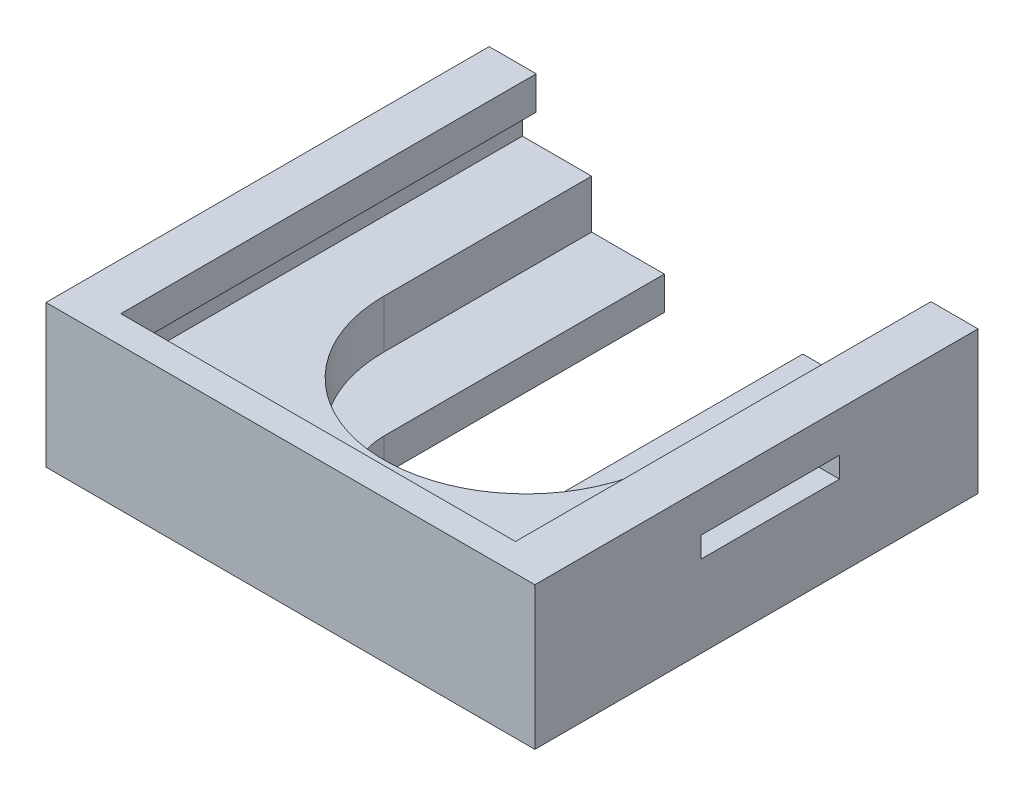
ISO-10303-21;
HEADER;
FILE_DESCRIPTION(('STEP AP214'),'2;1');
FILE_NAME('part.step','',(''),(''),'','','');
FILE_SCHEMA(('AUTOMOTIVE_DESIGN { 1 0 10303 214 1 1 1 1 }'));
ENDSEC;
DATA;
#1=APPLICATION_CONTEXT('core data for automotive mechanical design processes');
#2=APPLICATION_PROTOCOL_DEFINITION('international standard','automotive_design',2000,#1);
#3=PRODUCT_CONTEXT('',#1,'mechanical');
#4=PRODUCT('Part','Part','',(#3));
#5=PRODUCT_RELATED_PRODUCT_CATEGORY('part','',(#4));
#6=PRODUCT_DEFINITION_FORMATION('','',#4);
#7=PRODUCT_DEFINITION_CONTEXT('part definition',#1,'design');
#8=PRODUCT_DEFINITION('design','',#6,#7);
#9=PRODUCT_DEFINITION_SHAPE('','',#8);
#10=(LENGTH_UNIT() NAMED_UNIT(*) SI_UNIT(.MILLI.,.METRE.));
#11=(NAMED_UNIT(*) PLANE_ANGLE_UNIT() SI_UNIT($,.RADIAN.));
#12=(NAMED_UNIT(*) SI_UNIT($,.STERADIAN.) SOLID_ANGLE_UNIT());
#13=UNCERTAINTY_MEASURE_WITH_UNIT(LENGTH_MEASURE(1.E-05),#10,'distance_accuracy_value','');
#14=(GEOMETRIC_REPRESENTATION_CONTEXT(3) GLOBAL_UNCERTAINTY_ASSIGNED_CONTEXT((#13)) GLOBAL_UNIT_ASSIGNED_CONTEXT((#10,
#11,#12)) REPRESENTATION_CONTEXT('',''));
#15=CARTESIAN_POINT('',(0.,0.,0.));
#16=DIRECTION('',(0.,0.,1.));
#17=DIRECTION('',(1.,0.,0.));
#18=AXIS2_PLACEMENT_3D('',#15,#16,#17);
#19=CARTESIAN_POINT('',(0.,0.,0.));
#20=DIRECTION('',(0.,0.,1.));
#21=DIRECTION('',(1.,0.,0.));
#22=AXIS2_PLACEMENT_3D('',#19,#20,#21);
#23=PLANE('',#22);
#24=DIRECTION('',(-1.,0.,0.));
#25=VECTOR('',#24,1.);
#26=CARTESIAN_POINT('',(5.00000000000001,-3.5,0.));
#27=LINE('',#26,#25);
#28=CARTESIAN_POINT('',(10.25,-3.5,0.));
#29=VERTEX_POINT('',#28);
#30=CARTESIAN_POINT('',(5.00000000000001,-3.5,0.));
#31=VERTEX_POINT('',#30);
#32=EDGE_CURVE('E280',#29,#31,#27,.T.);
#33=ORIENTED_EDGE('',*,*,#32,.F.);
#34=DIRECTION('',(0.,1.,0.));
#35=VECTOR('',#34,1.);
#36=CARTESIAN_POINT('',(10.25,-5.9,0.));
#37=LINE('',#36,#35);
#38=CARTESIAN_POINT('',(10.25,-5.9,0.));
#39=VERTEX_POINT('',#38);
#40=EDGE_CURVE('E272',#39,#29,#37,.T.);
#41=ORIENTED_EDGE('',*,*,#40,.F.);
#42=DIRECTION('',(1.,0.,0.));
#43=VECTOR('',#42,1.);
#44=CARTESIAN_POINT('',(0.,-5.9,0.));
#45=LINE('',#44,#43);
#46=CARTESIAN_POINT('',(-2.4,-5.9,0.));
#47=VERTEX_POINT('',#46);
#48=EDGE_CURVE('E332',#47,#39,#45,.T.);
#49=ORIENTED_EDGE('',*,*,#48,.F.);
#50=DIRECTION('',(0.,-1.,0.));
#51=VECTOR('',#50,1.);
#52=CARTESIAN_POINT('',(-2.4,0.,0.));
#53=LINE('',#52,#51);
#54=CARTESIAN_POINT('',(-2.4,4.4,0.));
#55=VERTEX_POINT('',#54);
#56=EDGE_CURVE('E206',#55,#47,#53,.T.);
#57=ORIENTED_EDGE('',*,*,#56,.F.);
#58=DIRECTION('',(-1.,0.,0.));
#59=VECTOR('',#58,1.);
#60=CARTESIAN_POINT('',(0.,4.4,0.));
#61=LINE('',#60,#59);
#62=CARTESIAN_POINT('',(1.,4.4,0.));
#63=VERTEX_POINT('',#62);
#64=EDGE_CURVE('E311',#63,#55,#61,.T.);
#65=ORIENTED_EDGE('',*,*,#64,.F.);
#66=DIRECTION('',(0.,1.,0.));
#67=VECTOR('',#66,1.);
#68=CARTESIAN_POINT('',(1.,0.,0.));
#69=LINE('',#68,#67);
#70=CARTESIAN_POINT('',(1.,2.,0.));
#71=VERTEX_POINT('',#70);
#72=EDGE_CURVE('E357',#71,#63,#69,.T.);
#73=ORIENTED_EDGE('',*,*,#72,.F.);
#74=DIRECTION('',(1.,0.,0.));
#75=VECTOR('',#74,1.);
#76=CARTESIAN_POINT('',(0.,2.,0.));
#77=LINE('',#76,#75);
#78=CARTESIAN_POINT('',(0.,2.,0.));
#79=VERTEX_POINT('',#78);
#80=EDGE_CURVE('E355',#79,#71,#77,.T.);
#81=ORIENTED_EDGE('',*,*,#80,.F.);
#82=DIRECTION('',(0.,1.,0.));
#83=VECTOR('',#82,1.);
#84=CARTESIAN_POINT('',(0.,0.,0.));
#85=LINE('',#84,#83);
#86=CARTESIAN_POINT('',(0.,0.,0.));
#87=VERTEX_POINT('',#86);
#88=EDGE_CURVE('E353',#87,#79,#85,.T.);
#89=ORIENTED_EDGE('',*,*,#88,.F.);
#90=DIRECTION('',(1.,0.,0.));
#91=VECTOR('',#90,1.);
#92=CARTESIAN_POINT('',(0.,0.,0.));
#93=LINE('',#92,#91);
#94=CARTESIAN_POINT('',(5.00000000000001,0.,0.));
#95=VERTEX_POINT('',#94);
#96=EDGE_CURVE('E350',#87,#95,#93,.T.);
#97=ORIENTED_EDGE('',*,*,#96,.T.);
#98=DIRECTION('',(0.,1.,0.));
#99=VECTOR('',#98,1.);
#100=CARTESIAN_POINT('',(5.00000000000001,-3.5,0.));
#101=LINE('',#100,#99);
#102=EDGE_CURVE('E303',#31,#95,#101,.T.);
#103=ORIENTED_EDGE('',*,*,#102,.F.);
#104=EDGE_LOOP('',(#33,#41,#49,#57,#65,#73,#81,#89,#97,#103));
#105=FACE_BOUND('',#104,.T.);
#106=ADVANCED_FACE('F35',(#105),#23,.F.);
#107=CARTESIAN_POINT('',(15.25,-3.5,15.));
#108=DIRECTION('',(0.,1.,0.));
#109=DIRECTION('',(0.,0.,1.));
#110=AXIS2_PLACEMENT_3D('',#107,#108,#109);
#111=PLANE('',#110);
#112=DIRECTION('',(0.,0.,1.));
#113=VECTOR('',#112,1.);
#114=CARTESIAN_POINT('',(10.25,-3.5,20.25));
#115=LINE('',#114,#113);
#116=CARTESIAN_POINT('',(10.25,-3.5,20.25));
#117=VERTEX_POINT('',#116);
#118=EDGE_CURVE('E257',#29,#117,#115,.T.);
#119=ORIENTED_EDGE('',*,*,#118,.F.);
#120=ORIENTED_EDGE('',*,*,#32,.T.);
#121=DIRECTION('',(0.,0.,1.));
#122=VECTOR('',#121,1.);
#123=CARTESIAN_POINT('',(5.00000000000001,-3.5,15.));
#124=LINE('',#123,#122);
#125=CARTESIAN_POINT('',(5.00000000000001,-3.5,15.));
#126=VERTEX_POINT('',#125);
#127=EDGE_CURVE('E285',#31,#126,#124,.T.);
#128=ORIENTED_EDGE('',*,*,#127,.T.);
#129=CARTESIAN_POINT('',(15.25,-3.5,15.));
#130=DIRECTION('',(0.,1.,0.));
#131=DIRECTION('',(0.,0.,1.));
#132=AXIS2_PLACEMENT_3D('',#129,#130,#131);
#133=CIRCLE('',#132,10.25);
#134=CARTESIAN_POINT('',(15.25,-3.5,25.25));
#135=VERTEX_POINT('',#134);
#136=EDGE_CURVE('E289',#126,#135,#133,.T.);
#137=ORIENTED_EDGE('',*,*,#136,.T.);
#138=CARTESIAN_POINT('',(15.25,-3.5,20.25));
#139=DIRECTION('',(0.,1.,0.));
#140=DIRECTION('',(0.,0.,1.));
#141=AXIS2_PLACEMENT_3D('',#138,#139,#140);
#142=CIRCLE('',#141,5.);
#143=EDGE_CURVE('E252',#117,#135,#142,.T.);
#144=ORIENTED_EDGE('',*,*,#143,.F.);
#145=EDGE_LOOP('',(#119,#120,#128,#137,#144));
#146=FACE_BOUND('',#145,.T.);
#147=ADVANCED_FACE('F460',(#146),#111,.T.);
#148=CARTESIAN_POINT('',(-2.4,0.,30.));
#149=DIRECTION('',(1.,0.,0.));
#150=DIRECTION('',(0.,1.,0.));
#151=AXIS2_PLACEMENT_3D('',#148,#149,#150);
#152=PLANE('',#151);
#153=ORIENTED_EDGE('',*,*,#56,.T.);
#154=DIRECTION('',(0.,0.,-1.));
#155=VECTOR('',#154,1.);
#156=CARTESIAN_POINT('',(-2.4,-5.9,30.));
#157=LINE('',#156,#155);
#158=CARTESIAN_POINT('',(-2.4,-5.9,32.));
#159=VERTEX_POINT('',#158);
#160=EDGE_CURVE('E43',#159,#47,#157,.T.);
#161=ORIENTED_EDGE('',*,*,#160,.F.);
#162=DIRECTION('',(0.,-1.,0.));
#163=VECTOR('',#162,1.);
#164=CARTESIAN_POINT('',(-2.4,-5.9,32.));
#165=LINE('',#164,#163);
#166=CARTESIAN_POINT('',(-2.4,4.4,32.));
#167=VERTEX_POINT('',#166);
#168=EDGE_CURVE('E204',#167,#159,#165,.T.);
#169=ORIENTED_EDGE('',*,*,#168,.F.);
#170=DIRECTION('',(0.,0.,-1.));
#171=VECTOR('',#170,1.);
#172=CARTESIAN_POINT('',(-2.4,4.4,30.));
#173=LINE('',#172,#171);
#174=EDGE_CURVE('E329',#167,#55,#173,.T.);
#175=ORIENTED_EDGE('',*,*,#174,.T.);
#176=EDGE_LOOP('',(#153,#161,#169,#175));
#177=FACE_BOUND('',#176,.T.);
#178=ADVANCED_FACE('F37',(#177),#152,.F.);
#179=CARTESIAN_POINT('',(0.,-5.9,30.));
#180=DIRECTION('',(0.,1.,0.));
#181=DIRECTION('',(-1.,0.,0.));
#182=AXIS2_PLACEMENT_3D('',#179,#180,#181);
#183=PLANE('',#182);
#184=ORIENTED_EDGE('',*,*,#48,.T.);
#185=DIRECTION('',(0.,0.,1.));
#186=VECTOR('',#185,1.);
#187=CARTESIAN_POINT('',(10.25,-5.9,20.25));
#188=LINE('',#187,#186);
#189=CARTESIAN_POINT('',(10.25,-5.9,20.25));
#190=VERTEX_POINT('',#189);
#191=EDGE_CURVE('E260',#39,#190,#188,.T.);
#192=ORIENTED_EDGE('',*,*,#191,.T.);
#193=CARTESIAN_POINT('',(15.25,-5.9,20.25));
#194=DIRECTION('',(0.,1.,0.));
#195=DIRECTION('',(0.,0.,1.));
#196=AXIS2_PLACEMENT_3D('',#193,#194,#195);
#197=CIRCLE('',#196,5.);
#198=CARTESIAN_POINT('',(20.25,-5.9,20.25));
#199=VERTEX_POINT('',#198);
#200=EDGE_CURVE('E253',#190,#199,#197,.T.);
#201=ORIENTED_EDGE('',*,*,#200,.T.);
#202=DIRECTION('',(0.,0.,-1.));
#203=VECTOR('',#202,1.);
#204=CARTESIAN_POINT('',(20.25,-5.9,0.));
#205=LINE('',#204,#203);
#206=CARTESIAN_POINT('',(20.25,-5.9,0.));
#207=VERTEX_POINT('',#206);
#208=EDGE_CURVE('E256',#199,#207,#205,.T.);
#209=ORIENTED_EDGE('',*,*,#208,.T.);
#210=CARTESIAN_POINT('',(32.9,-5.9,0.));
#211=VERTEX_POINT('',#210);
#212=EDGE_CURVE('E331',#207,#211,#45,.T.);
#213=ORIENTED_EDGE('',*,*,#212,.T.);
#214=DIRECTION('',(0.,0.,-1.));
#215=VECTOR('',#214,1.);
#216=CARTESIAN_POINT('',(32.9,-5.9,30.));
#217=LINE('',#216,#215);
#218=CARTESIAN_POINT('',(32.9,-5.9,32.));
#219=VERTEX_POINT('',#218);
#220=EDGE_CURVE('E209',#219,#211,#217,.T.);
#221=ORIENTED_EDGE('',*,*,#220,.F.);
#222=DIRECTION('',(1.,0.,0.));
#223=VECTOR('',#222,1.);
#224=CARTESIAN_POINT('',(-2.4,-5.9,32.));
#225=LINE('',#224,#223);
#226=EDGE_CURVE('E211',#159,#219,#225,.T.);
#227=ORIENTED_EDGE('',*,*,#226,.F.);
#228=ORIENTED_EDGE('',*,*,#160,.T.);
#229=EDGE_LOOP('',(#184,#192,#201,#209,#213,#221,#227,#228));
#230=FACE_BOUND('',#229,.T.);
#231=ADVANCED_FACE('F212',(#230),#183,.F.);
#232=CARTESIAN_POINT('',(32.9,0.,30.));
#233=DIRECTION('',(1.,0.,0.));
#234=DIRECTION('',(0.,0.,-1.));
#235=AXIS2_PLACEMENT_3D('',#232,#233,#234);
#236=PLANE('',#235);
#237=DIRECTION('',(0.,1.,0.));
#238=VECTOR('',#237,1.);
#239=CARTESIAN_POINT('',(32.9,0.,10.));
#240=LINE('',#239,#238);
#241=CARTESIAN_POINT('',(32.9,0.,10.));
#242=VERTEX_POINT('',#241);
#243=CARTESIAN_POINT('',(32.9,1.5,10.));
#244=VERTEX_POINT('',#243);
#245=EDGE_CURVE('E250',#242,#244,#240,.T.);
#246=ORIENTED_EDGE('',*,*,#245,.F.);
#247=DIRECTION('',(0.,0.,-1.));
#248=VECTOR('',#247,1.);
#249=CARTESIAN_POINT('',(32.9,0.,30.));
#250=LINE('',#249,#248);
#251=CARTESIAN_POINT('',(32.9,0.,20.));
#252=VERTEX_POINT('',#251);
#253=EDGE_CURVE('E240',#252,#242,#250,.T.);
#254=ORIENTED_EDGE('',*,*,#253,.F.);
#255=DIRECTION('',(0.,-1.,0.));
#256=VECTOR('',#255,1.);
#257=CARTESIAN_POINT('',(32.9,0.,20.));
#258=LINE('',#257,#256);
#259=CARTESIAN_POINT('',(32.9,1.5,20.));
#260=VERTEX_POINT('',#259);
#261=EDGE_CURVE('E246',#260,#252,#258,.T.);
#262=ORIENTED_EDGE('',*,*,#261,.F.);
#263=DIRECTION('',(0.,0.,1.));
#264=VECTOR('',#263,1.);
#265=CARTESIAN_POINT('',(32.9,1.5,30.));
#266=LINE('',#265,#264);
#267=EDGE_CURVE('E248',#244,#260,#266,.T.);
#268=ORIENTED_EDGE('',*,*,#267,.F.);
#269=EDGE_LOOP('',(#246,#254,#262,#268));
#270=FACE_BOUND('',#269,.T.);
#271=DIRECTION('',(0.,-1.,0.));
#272=VECTOR('',#271,1.);
#273=CARTESIAN_POINT('',(32.9,0.,0.));
#274=LINE('',#273,#272);
#275=CARTESIAN_POINT('',(32.9,4.4,0.));
#276=VERTEX_POINT('',#275);
#277=EDGE_CURVE('E334',#276,#211,#274,.T.);
#278=ORIENTED_EDGE('',*,*,#277,.F.);
#279=DIRECTION('',(0.,0.,-1.));
#280=VECTOR('',#279,1.);
#281=CARTESIAN_POINT('',(32.9,4.4,30.));
#282=LINE('',#281,#280);
#283=CARTESIAN_POINT('',(32.9,4.4,32.));
#284=VERTEX_POINT('',#283);
#285=EDGE_CURVE('E381',#284,#276,#282,.T.);
#286=ORIENTED_EDGE('',*,*,#285,.F.);
#287=DIRECTION('',(0.,1.,0.));
#288=VECTOR('',#287,1.);
#289=CARTESIAN_POINT('',(32.9,-5.9,32.));
#290=LINE('',#289,#288);
#291=EDGE_CURVE('E217',#219,#284,#290,.T.);
#292=ORIENTED_EDGE('',*,*,#291,.F.);
#293=ORIENTED_EDGE('',*,*,#220,.T.);
#294=EDGE_LOOP('',(#278,#286,#292,#293));
#295=FACE_BOUND('',#294,.T.);
#296=ADVANCED_FACE('F385',(#270,#295),#236,.T.);
#297=CARTESIAN_POINT('',(29.5,-1.27935856353291E-13,30.));
#298=DIRECTION('',(-1.,0.,0.));
#299=DIRECTION('',(0.,-1.,0.));
#300=AXIS2_PLACEMENT_3D('',#297,#298,#299);
#301=PLANE('',#300);
#302=DIRECTION('',(0.,1.,0.));
#303=VECTOR('',#302,1.);
#304=CARTESIAN_POINT('',(29.5,-1.27935856353291E-13,0.));
#305=LINE('',#304,#303);
#306=CARTESIAN_POINT('',(29.5,2.00000000000003,0.));
#307=VERTEX_POINT('',#306);
#308=CARTESIAN_POINT('',(29.5,4.4,0.));
#309=VERTEX_POINT('',#308);
#310=EDGE_CURVE('E340',#307,#309,#305,.T.);
#311=ORIENTED_EDGE('',*,*,#310,.F.);
#312=DIRECTION('',(0.,0.,-1.));
#313=VECTOR('',#312,1.);
#314=CARTESIAN_POINT('',(29.5,2.00000000000003,30.));
#315=LINE('',#314,#313);
#316=CARTESIAN_POINT('',(29.5,2.00000000000003,30.));
#317=VERTEX_POINT('',#316);
#318=EDGE_CURVE('E377',#317,#307,#315,.T.);
#319=ORIENTED_EDGE('',*,*,#318,.F.);
#320=DIRECTION('',(0.,1.,0.));
#321=VECTOR('',#320,1.);
#322=CARTESIAN_POINT('',(29.5,-1.27935856353291E-13,30.));
#323=LINE('',#322,#321);
#324=CARTESIAN_POINT('',(29.5,4.4,30.));
#325=VERTEX_POINT('',#324);
#326=EDGE_CURVE('E307',#317,#325,#323,.T.);
#327=ORIENTED_EDGE('',*,*,#326,.T.);
#328=DIRECTION('',(0.,0.,-1.));
#329=VECTOR('',#328,1.);
#330=CARTESIAN_POINT('',(29.5,4.4,30.));
#331=LINE('',#330,#329);
#332=EDGE_CURVE('E379',#325,#309,#331,.T.);
#333=ORIENTED_EDGE('',*,*,#332,.T.);
#334=EDGE_LOOP('',(#311,#319,#327,#333));
#335=FACE_BOUND('',#334,.T.);
#336=ADVANCED_FACE('F435',(#335),#301,.T.);
#337=CARTESIAN_POINT('',(0.,2.00000000000087,30.));
#338=DIRECTION('',(0.,-1.,0.));
#339=DIRECTION('',(1.,0.,0.));
#340=AXIS2_PLACEMENT_3D('',#337,#338,#339);
#341=PLANE('',#340);
#342=DIRECTION('',(-1.,0.,0.));
#343=VECTOR('',#342,1.);
#344=CARTESIAN_POINT('',(0.,2.00000000000087,0.));
#345=LINE('',#344,#343);
#346=CARTESIAN_POINT('',(30.5,2.,0.));
#347=VERTEX_POINT('',#346);
#348=EDGE_CURVE('E343',#347,#307,#345,.T.);
#349=ORIENTED_EDGE('',*,*,#348,.F.);
#350=DIRECTION('',(0.,0.,-1.));
#351=VECTOR('',#350,1.);
#352=CARTESIAN_POINT('',(30.5,2.,30.));
#353=LINE('',#352,#351);
#354=CARTESIAN_POINT('',(30.5,2.,30.));
#355=VERTEX_POINT('',#354);
#356=EDGE_CURVE('E375',#355,#347,#353,.T.);
#357=ORIENTED_EDGE('',*,*,#356,.F.);
#358=DIRECTION('',(-1.,0.,0.));
#359=VECTOR('',#358,1.);
#360=CARTESIAN_POINT('',(0.,2.00000000000087,30.));
#361=LINE('',#360,#359);
#362=EDGE_CURVE('E310',#355,#317,#361,.T.);
#363=ORIENTED_EDGE('',*,*,#362,.T.);
#364=ORIENTED_EDGE('',*,*,#318,.T.);
#365=EDGE_LOOP('',(#349,#357,#363,#364));
#366=FACE_BOUND('',#365,.T.);
#367=ADVANCED_FACE('F431',(#366),#341,.T.);
#368=CARTESIAN_POINT('',(30.5,0.,30.));
#369=DIRECTION('',(-1.,0.,0.));
#370=DIRECTION('',(0.,0.,1.));
#371=AXIS2_PLACEMENT_3D('',#368,#369,#370);
#372=PLANE('',#371);
#373=DIRECTION('',(0.,-1.,0.));
#374=VECTOR('',#373,1.);
#375=CARTESIAN_POINT('',(30.5,0.,10.));
#376=LINE('',#375,#374);
#377=CARTESIAN_POINT('',(30.5,1.5,10.));
#378=VERTEX_POINT('',#377);
#379=CARTESIAN_POINT('',(30.5,0.,10.));
#380=VERTEX_POINT('',#379);
#381=EDGE_CURVE('E58',#378,#380,#376,.T.);
#382=ORIENTED_EDGE('',*,*,#381,.F.);
#383=DIRECTION('',(0.,0.,-1.));
#384=VECTOR('',#383,1.);
#385=CARTESIAN_POINT('',(30.5,1.5,10.));
#386=LINE('',#385,#384);
#387=CARTESIAN_POINT('',(30.5,1.5,20.));
#388=VERTEX_POINT('',#387);
#389=EDGE_CURVE('E234',#388,#378,#386,.T.);
#390=ORIENTED_EDGE('',*,*,#389,.F.);
#391=DIRECTION('',(0.,1.,0.));
#392=VECTOR('',#391,1.);
#393=CARTESIAN_POINT('',(30.5,0.,20.));
#394=LINE('',#393,#392);
#395=CARTESIAN_POINT('',(30.5,0.,20.));
#396=VERTEX_POINT('',#395);
#397=EDGE_CURVE('E231',#396,#388,#394,.T.);
#398=ORIENTED_EDGE('',*,*,#397,.F.);
#399=DIRECTION('',(0.,0.,-1.));
#400=VECTOR('',#399,1.);
#401=CARTESIAN_POINT('',(30.5,0.,30.));
#402=LINE('',#401,#400);
#403=CARTESIAN_POINT('',(30.5,0.,30.));
#404=VERTEX_POINT('',#403);
#405=EDGE_CURVE('E373',#404,#396,#402,.T.);
#406=ORIENTED_EDGE('',*,*,#405,.F.);
#407=DIRECTION('',(0.,1.,0.));
#408=VECTOR('',#407,1.);
#409=CARTESIAN_POINT('',(30.5,0.,30.));
#410=LINE('',#409,#408);
#411=EDGE_CURVE('E314',#404,#355,#410,.T.);
#412=ORIENTED_EDGE('',*,*,#411,.T.);
#413=ORIENTED_EDGE('',*,*,#356,.T.);
#414=DIRECTION('',(0.,1.,0.));
#415=VECTOR('',#414,1.);
#416=CARTESIAN_POINT('',(30.5,0.,0.));
#417=LINE('',#416,#415);
#418=CARTESIAN_POINT('',(30.5,0.,0.));
#419=VERTEX_POINT('',#418);
#420=EDGE_CURVE('E346',#419,#347,#417,.T.);
#421=ORIENTED_EDGE('',*,*,#420,.F.);
#422=EDGE_CURVE('E372',#380,#419,#402,.T.);
#423=ORIENTED_EDGE('',*,*,#422,.F.);
#424=EDGE_LOOP('',(#382,#390,#398,#406,#412,#413,#421,#423));
#425=FACE_BOUND('',#424,.T.);
#426=ADVANCED_FACE('F427',(#425),#372,.T.);
#427=CARTESIAN_POINT('',(0.,0.,30.));
#428=DIRECTION('',(0.,1.,0.));
#429=DIRECTION('',(0.,0.,1.));
#430=AXIS2_PLACEMENT_3D('',#427,#428,#429);
#431=PLANE('',#430);
#432=DIRECTION('',(0.,0.,-1.));
#433=VECTOR('',#432,1.);
#434=CARTESIAN_POINT('',(25.5,0.,0.));
#435=LINE('',#434,#433);
#436=CARTESIAN_POINT('',(25.5,0.,15.));
#437=VERTEX_POINT('',#436);
#438=CARTESIAN_POINT('',(25.5,0.,0.));
#439=VERTEX_POINT('',#438);
#440=EDGE_CURVE('E271',#437,#439,#435,.T.);
#441=ORIENTED_EDGE('',*,*,#440,.F.);
#442=CARTESIAN_POINT('',(15.25,0.,15.));
#443=DIRECTION('',(0.,1.,0.));
#444=DIRECTION('',(0.,0.,1.));
#445=AXIS2_PLACEMENT_3D('',#442,#443,#444);
#446=CIRCLE('',#445,10.25);
#447=CARTESIAN_POINT('',(5.00000000000001,0.,15.));
#448=VERTEX_POINT('',#447);
#449=EDGE_CURVE('E281',#448,#437,#446,.T.);
#450=ORIENTED_EDGE('',*,*,#449,.F.);
#451=DIRECTION('',(0.,0.,1.));
#452=VECTOR('',#451,1.);
#453=CARTESIAN_POINT('',(5.00000000000001,0.,15.));
#454=LINE('',#453,#452);
#455=EDGE_CURVE('E294',#95,#448,#454,.T.);
#456=ORIENTED_EDGE('',*,*,#455,.F.);
#457=ORIENTED_EDGE('',*,*,#96,.F.);
#458=DIRECTION('',(0.,0.,-1.));
#459=VECTOR('',#458,1.);
#460=CARTESIAN_POINT('',(0.,0.,30.));
#461=LINE('',#460,#459);
#462=CARTESIAN_POINT('',(0.,0.,30.));
#463=VERTEX_POINT('',#462);
#464=EDGE_CURVE('E370',#463,#87,#461,.T.);
#465=ORIENTED_EDGE('',*,*,#464,.F.);
#466=DIRECTION('',(1.,0.,0.));
#467=VECTOR('',#466,1.);
#468=CARTESIAN_POINT('',(0.,0.,30.));
#469=LINE('',#468,#467);
#470=EDGE_CURVE('E317',#463,#404,#469,.T.);
#471=ORIENTED_EDGE('',*,*,#470,.T.);
#472=ORIENTED_EDGE('',*,*,#405,.T.);
#473=DIRECTION('',(-1.,0.,0.));
#474=VECTOR('',#473,1.);
#475=CARTESIAN_POINT('',(34.,0.,20.));
#476=LINE('',#475,#474);
#477=EDGE_CURVE('E50',#252,#396,#476,.T.);
#478=ORIENTED_EDGE('',*,*,#477,.F.);
#479=ORIENTED_EDGE('',*,*,#253,.T.);
#480=DIRECTION('',(-1.,0.,0.));
#481=VECTOR('',#480,1.);
#482=CARTESIAN_POINT('',(34.,0.,10.));
#483=LINE('',#482,#481);
#484=EDGE_CURVE('E237',#242,#380,#483,.T.);
#485=ORIENTED_EDGE('',*,*,#484,.T.);
#486=ORIENTED_EDGE('',*,*,#422,.T.);
#487=EDGE_CURVE('E349',#439,#419,#93,.T.);
#488=ORIENTED_EDGE('',*,*,#487,.F.);
#489=EDGE_LOOP('',(#441,#450,#456,#457,#465,#471,#472,#478,#479,#485,#486,#488));
#490=FACE_BOUND('',#489,.T.);
#491=ADVANCED_FACE('F423',(#490),#431,.T.);
#492=CARTESIAN_POINT('',(0.,0.,30.));
#493=DIRECTION('',(-1.,0.,0.));
#494=DIRECTION('',(0.,0.,1.));
#495=AXIS2_PLACEMENT_3D('',#492,#493,#494);
#496=PLANE('',#495);
#497=ORIENTED_EDGE('',*,*,#88,.T.);
#498=DIRECTION('',(0.,0.,-1.));
#499=VECTOR('',#498,1.);
#500=CARTESIAN_POINT('',(0.,2.,30.));
#501=LINE('',#500,#499);
#502=CARTESIAN_POINT('',(0.,2.,30.));
#503=VERTEX_POINT('',#502);
#504=EDGE_CURVE('E367',#503,#79,#501,.T.);
#505=ORIENTED_EDGE('',*,*,#504,.F.);
#506=DIRECTION('',(0.,1.,0.));
#507=VECTOR('',#506,1.);
#508=CARTESIAN_POINT('',(0.,0.,30.));
#509=LINE('',#508,#507);
#510=EDGE_CURVE('E320',#463,#503,#509,.T.);
#511=ORIENTED_EDGE('',*,*,#510,.F.);
#512=ORIENTED_EDGE('',*,*,#464,.T.);
#513=EDGE_LOOP('',(#497,#505,#511,#512));
#514=FACE_BOUND('',#513,.T.);
#515=ADVANCED_FACE('F450',(#514),#496,.F.);
#516=CARTESIAN_POINT('',(0.,2.,30.));
#517=DIRECTION('',(0.,1.,0.));
#518=DIRECTION('',(0.,0.,1.));
#519=AXIS2_PLACEMENT_3D('',#516,#517,#518);
#520=PLANE('',#519);
#521=ORIENTED_EDGE('',*,*,#80,.T.);
#522=DIRECTION('',(0.,0.,-1.));
#523=VECTOR('',#522,1.);
#524=CARTESIAN_POINT('',(1.,2.,30.));
#525=LINE('',#524,#523);
#526=CARTESIAN_POINT('',(1.,2.,30.));
#527=VERTEX_POINT('',#526);
#528=EDGE_CURVE('E364',#527,#71,#525,.T.);
#529=ORIENTED_EDGE('',*,*,#528,.F.);
#530=DIRECTION('',(1.,0.,0.));
#531=VECTOR('',#530,1.);
#532=CARTESIAN_POINT('',(0.,2.,30.));
#533=LINE('',#532,#531);
#534=EDGE_CURVE('E323',#503,#527,#533,.T.);
#535=ORIENTED_EDGE('',*,*,#534,.F.);
#536=ORIENTED_EDGE('',*,*,#504,.T.);
#537=EDGE_LOOP('',(#521,#529,#535,#536));
#538=FACE_BOUND('',#537,.T.);
#539=ADVANCED_FACE('F446',(#538),#520,.F.);
#540=CARTESIAN_POINT('',(1.,0.,30.));
#541=DIRECTION('',(-1.,0.,0.));
#542=DIRECTION('',(0.,0.,1.));
#543=AXIS2_PLACEMENT_3D('',#540,#541,#542);
#544=PLANE('',#543);
#545=ORIENTED_EDGE('',*,*,#72,.T.);
#546=DIRECTION('',(0.,0.,-1.));
#547=VECTOR('',#546,1.);
#548=CARTESIAN_POINT('',(1.,4.4,30.));
#549=LINE('',#548,#547);
#550=CARTESIAN_POINT('',(1.,4.4,30.));
#551=VERTEX_POINT('',#550);
#552=EDGE_CURVE('E361',#551,#63,#549,.T.);
#553=ORIENTED_EDGE('',*,*,#552,.F.);
#554=DIRECTION('',(0.,1.,0.));
#555=VECTOR('',#554,1.);
#556=CARTESIAN_POINT('',(1.,0.,30.));
#557=LINE('',#556,#555);
#558=EDGE_CURVE('E326',#527,#551,#557,.T.);
#559=ORIENTED_EDGE('',*,*,#558,.F.);
#560=ORIENTED_EDGE('',*,*,#528,.T.);
#561=EDGE_LOOP('',(#545,#553,#559,#560));
#562=FACE_BOUND('',#561,.T.);
#563=ADVANCED_FACE('F441',(#562),#544,.F.);
#564=CARTESIAN_POINT('',(0.,4.4,30.));
#565=DIRECTION('',(0.,-1.,0.));
#566=DIRECTION('',(0.,0.,-1.));
#567=AXIS2_PLACEMENT_3D('',#564,#565,#566);
#568=PLANE('',#567);
#569=ORIENTED_EDGE('',*,*,#64,.T.);
#570=ORIENTED_EDGE('',*,*,#174,.F.);
#571=DIRECTION('',(-1.,0.,0.));
#572=VECTOR('',#571,1.);
#573=CARTESIAN_POINT('',(-2.4,4.4,32.));
#574=LINE('',#573,#572);
#575=EDGE_CURVE('E222',#284,#167,#574,.T.);
#576=ORIENTED_EDGE('',*,*,#575,.F.);
#577=ORIENTED_EDGE('',*,*,#285,.T.);
#578=DIRECTION('',(1.,0.,0.));
#579=VECTOR('',#578,1.);
#580=CARTESIAN_POINT('',(0.,4.4,0.));
#581=LINE('',#580,#579);
#582=EDGE_CURVE('E337',#309,#276,#581,.T.);
#583=ORIENTED_EDGE('',*,*,#582,.F.);
#584=ORIENTED_EDGE('',*,*,#332,.F.);
#585=DIRECTION('',(-1.,0.,0.));
#586=VECTOR('',#585,1.);
#587=CARTESIAN_POINT('',(-2.4,4.4,30.));
#588=LINE('',#587,#586);
#589=EDGE_CURVE('E223',#325,#551,#588,.T.);
#590=ORIENTED_EDGE('',*,*,#589,.T.);
#591=ORIENTED_EDGE('',*,*,#552,.T.);
#592=EDGE_LOOP('',(#569,#570,#576,#577,#583,#584,#590,#591));
#593=FACE_BOUND('',#592,.T.);
#594=ADVANCED_FACE('F392',(#593),#568,.F.);
#595=ORIENTED_EDGE('',*,*,#212,.F.);
#596=DIRECTION('',(0.,1.,0.));
#597=VECTOR('',#596,1.);
#598=CARTESIAN_POINT('',(20.25,-5.9,0.));
#599=LINE('',#598,#597);
#600=CARTESIAN_POINT('',(20.25,-3.5,0.));
#601=VERTEX_POINT('',#600);
#602=EDGE_CURVE('E274',#207,#601,#599,.T.);
#603=ORIENTED_EDGE('',*,*,#602,.T.);
#604=CARTESIAN_POINT('',(25.5,-3.5,0.));
#605=VERTEX_POINT('',#604);
#606=EDGE_CURVE('E282',#605,#601,#27,.T.);
#607=ORIENTED_EDGE('',*,*,#606,.F.);
#608=DIRECTION('',(0.,1.,0.));
#609=VECTOR('',#608,1.);
#610=CARTESIAN_POINT('',(25.5,-3.5,0.));
#611=LINE('',#610,#609);
#612=EDGE_CURVE('E292',#605,#439,#611,.T.);
#613=ORIENTED_EDGE('',*,*,#612,.T.);
#614=ORIENTED_EDGE('',*,*,#487,.T.);
#615=ORIENTED_EDGE('',*,*,#420,.T.);
#616=ORIENTED_EDGE('',*,*,#348,.T.);
#617=ORIENTED_EDGE('',*,*,#310,.T.);
#618=ORIENTED_EDGE('',*,*,#582,.T.);
#619=ORIENTED_EDGE('',*,*,#277,.T.);
#620=EDGE_LOOP('',(#595,#603,#607,#613,#614,#615,#616,#617,#618,#619));
#621=FACE_BOUND('',#620,.T.);
#622=ADVANCED_FACE('F388',(#621),#23,.F.);
#623=CARTESIAN_POINT('',(25.5,-3.5,0.));
#624=DIRECTION('',(1.,0.,0.));
#625=DIRECTION('',(0.,0.,-1.));
#626=AXIS2_PLACEMENT_3D('',#623,#624,#625);
#627=PLANE('',#626);
#628=ORIENTED_EDGE('',*,*,#440,.T.);
#629=ORIENTED_EDGE('',*,*,#612,.F.);
#630=DIRECTION('',(0.,0.,-1.));
#631=VECTOR('',#630,1.);
#632=CARTESIAN_POINT('',(25.5,-3.5,0.));
#633=LINE('',#632,#631);
#634=CARTESIAN_POINT('',(25.5,-3.5,15.));
#635=VERTEX_POINT('',#634);
#636=EDGE_CURVE('E278',#635,#605,#633,.T.);
#637=ORIENTED_EDGE('',*,*,#636,.F.);
#638=DIRECTION('',(0.,1.,0.));
#639=VECTOR('',#638,1.);
#640=CARTESIAN_POINT('',(25.5,-3.5,15.));
#641=LINE('',#640,#639);
#642=EDGE_CURVE('E299',#635,#437,#641,.T.);
#643=ORIENTED_EDGE('',*,*,#642,.T.);
#644=EDGE_LOOP('',(#628,#629,#637,#643));
#645=FACE_BOUND('',#644,.T.);
#646=ADVANCED_FACE('F418',(#645),#627,.F.);
#647=CARTESIAN_POINT('',(15.25,-3.5,15.));
#648=DIRECTION('',(0.,1.,0.));
#649=DIRECTION('',(0.,0.,1.));
#650=AXIS2_PLACEMENT_3D('',#647,#648,#649);
#651=CYLINDRICAL_SURFACE('',#650,10.25);
#652=ORIENTED_EDGE('',*,*,#449,.T.);
#653=ORIENTED_EDGE('',*,*,#642,.F.);
#654=EDGE_CURVE('E288',#135,#635,#133,.T.);
#655=ORIENTED_EDGE('',*,*,#654,.F.);
#656=ORIENTED_EDGE('',*,*,#136,.F.);
#657=DIRECTION('',(0.,1.,0.));
#658=VECTOR('',#657,1.);
#659=CARTESIAN_POINT('',(5.00000000000001,-3.5,15.));
#660=LINE('',#659,#658);
#661=EDGE_CURVE('E301',#126,#448,#660,.T.);
#662=ORIENTED_EDGE('',*,*,#661,.T.);
#663=EDGE_LOOP('',(#652,#653,#655,#656,#662));
#664=FACE_BOUND('',#663,.T.);
#665=ADVANCED_FACE('F462',(#664),#651,.F.);
#666=CARTESIAN_POINT('',(5.00000000000001,-3.5,15.));
#667=DIRECTION('',(-1.,0.,0.));
#668=DIRECTION('',(0.,0.,1.));
#669=AXIS2_PLACEMENT_3D('',#666,#667,#668);
#670=PLANE('',#669);
#671=ORIENTED_EDGE('',*,*,#455,.T.);
#672=ORIENTED_EDGE('',*,*,#661,.F.);
#673=ORIENTED_EDGE('',*,*,#127,.F.);
#674=ORIENTED_EDGE('',*,*,#102,.T.);
#675=EDGE_LOOP('',(#671,#672,#673,#674));
#676=FACE_BOUND('',#675,.T.);
#677=ADVANCED_FACE('F457',(#676),#670,.F.);
#678=CARTESIAN_POINT('',(15.25,-3.5,20.25));
#679=DIRECTION('',(0.,1.,0.));
#680=DIRECTION('',(0.,0.,1.));
#681=AXIS2_PLACEMENT_3D('',#678,#679,#680);
#682=CIRCLE('',#681,5.);
#683=CARTESIAN_POINT('',(20.25,-3.5,20.25));
#684=VERTEX_POINT('',#683);
#685=EDGE_CURVE('E11',#135,#684,#682,.T.);
#686=ORIENTED_EDGE('',*,*,#685,.F.);
#687=ORIENTED_EDGE('',*,*,#654,.T.);
#688=ORIENTED_EDGE('',*,*,#636,.T.);
#689=ORIENTED_EDGE('',*,*,#606,.T.);
#690=DIRECTION('',(0.,0.,-1.));
#691=VECTOR('',#690,1.);
#692=CARTESIAN_POINT('',(20.25,-3.5,0.));
#693=LINE('',#692,#691);
#694=EDGE_CURVE('E265',#684,#601,#693,.T.);
#695=ORIENTED_EDGE('',*,*,#694,.F.);
#696=EDGE_LOOP('',(#686,#687,#688,#689,#695));
#697=FACE_BOUND('',#696,.T.);
#698=ADVANCED_FACE('F412',(#697),#111,.T.);
#699=CARTESIAN_POINT('',(15.25,-5.9,20.25));
#700=DIRECTION('',(0.,1.,0.));
#701=DIRECTION('',(0.,0.,1.));
#702=AXIS2_PLACEMENT_3D('',#699,#700,#701);
#703=CYLINDRICAL_SURFACE('',#702,5.);
#704=ORIENTED_EDGE('',*,*,#143,.T.);
#705=ORIENTED_EDGE('',*,*,#685,.T.);
#706=DIRECTION('',(0.,1.,0.));
#707=VECTOR('',#706,1.);
#708=CARTESIAN_POINT('',(20.25,-5.9,20.25));
#709=LINE('',#708,#707);
#710=EDGE_CURVE('E263',#199,#684,#709,.T.);
#711=ORIENTED_EDGE('',*,*,#710,.F.);
#712=ORIENTED_EDGE('',*,*,#200,.F.);
#713=DIRECTION('',(0.,1.,0.));
#714=VECTOR('',#713,1.);
#715=CARTESIAN_POINT('',(10.25,-5.9,20.25));
#716=LINE('',#715,#714);
#717=EDGE_CURVE('E269',#190,#117,#716,.T.);
#718=ORIENTED_EDGE('',*,*,#717,.T.);
#719=EDGE_LOOP('',(#704,#705,#711,#712,#718));
#720=FACE_BOUND('',#719,.T.);
#721=ADVANCED_FACE('F404',(#720),#703,.F.);
#722=CARTESIAN_POINT('',(10.25,-5.9,20.25));
#723=DIRECTION('',(-1.,0.,0.));
#724=DIRECTION('',(0.,0.,1.));
#725=AXIS2_PLACEMENT_3D('',#722,#723,#724);
#726=PLANE('',#725);
#727=ORIENTED_EDGE('',*,*,#118,.T.);
#728=ORIENTED_EDGE('',*,*,#717,.F.);
#729=ORIENTED_EDGE('',*,*,#191,.F.);
#730=ORIENTED_EDGE('',*,*,#40,.T.);
#731=EDGE_LOOP('',(#727,#728,#729,#730));
#732=FACE_BOUND('',#731,.T.);
#733=ADVANCED_FACE('F400',(#732),#726,.F.);
#734=CARTESIAN_POINT('',(20.25,-5.9,0.));
#735=DIRECTION('',(1.,0.,0.));
#736=DIRECTION('',(0.,0.,-1.));
#737=AXIS2_PLACEMENT_3D('',#734,#735,#736);
#738=PLANE('',#737);
#739=ORIENTED_EDGE('',*,*,#694,.T.);
#740=ORIENTED_EDGE('',*,*,#602,.F.);
#741=ORIENTED_EDGE('',*,*,#208,.F.);
#742=ORIENTED_EDGE('',*,*,#710,.T.);
#743=EDGE_LOOP('',(#739,#740,#741,#742));
#744=FACE_BOUND('',#743,.T.);
#745=ADVANCED_FACE('F409',(#744),#738,.F.);
#746=CARTESIAN_POINT('',(34.,0.,10.));
#747=DIRECTION('',(0.,0.,-1.));
#748=DIRECTION('',(-1.,0.,0.));
#749=AXIS2_PLACEMENT_3D('',#746,#747,#748);
#750=PLANE('',#749);
#751=ORIENTED_EDGE('',*,*,#245,.T.);
#752=DIRECTION('',(-1.,0.,0.));
#753=VECTOR('',#752,1.);
#754=CARTESIAN_POINT('',(34.,1.5,10.));
#755=LINE('',#754,#753);
#756=EDGE_CURVE('E238',#244,#378,#755,.T.);
#757=ORIENTED_EDGE('',*,*,#756,.T.);
#758=ORIENTED_EDGE('',*,*,#381,.T.);
#759=ORIENTED_EDGE('',*,*,#484,.F.);
#760=EDGE_LOOP('',(#751,#757,#758,#759));
#761=FACE_BOUND('',#760,.T.);
#762=ADVANCED_FACE('F558',(#761),#750,.F.);
#763=CARTESIAN_POINT('',(34.,1.5,10.));
#764=DIRECTION('',(0.,1.,0.));
#765=DIRECTION('',(0.,0.,1.));
#766=AXIS2_PLACEMENT_3D('',#763,#764,#765);
#767=PLANE('',#766);
#768=ORIENTED_EDGE('',*,*,#267,.T.);
#769=DIRECTION('',(-1.,0.,0.));
#770=VECTOR('',#769,1.);
#771=CARTESIAN_POINT('',(34.,1.5,20.));
#772=LINE('',#771,#770);
#773=EDGE_CURVE('E241',#260,#388,#772,.T.);
#774=ORIENTED_EDGE('',*,*,#773,.T.);
#775=ORIENTED_EDGE('',*,*,#389,.T.);
#776=ORIENTED_EDGE('',*,*,#756,.F.);
#777=EDGE_LOOP('',(#768,#774,#775,#776));
#778=FACE_BOUND('',#777,.T.);
#779=ADVANCED_FACE('F568',(#778),#767,.F.);
#780=CARTESIAN_POINT('',(34.,0.,20.));
#781=DIRECTION('',(0.,0.,1.));
#782=DIRECTION('',(1.,0.,0.));
#783=AXIS2_PLACEMENT_3D('',#780,#781,#782);
#784=PLANE('',#783);
#785=ORIENTED_EDGE('',*,*,#261,.T.);
#786=ORIENTED_EDGE('',*,*,#477,.T.);
#787=ORIENTED_EDGE('',*,*,#397,.T.);
#788=ORIENTED_EDGE('',*,*,#773,.F.);
#789=EDGE_LOOP('',(#785,#786,#787,#788));
#790=FACE_BOUND('',#789,.T.);
#791=ADVANCED_FACE('F576',(#790),#784,.F.);
#792=CARTESIAN_POINT('',(0.,0.,30.));
#793=DIRECTION('',(0.,0.,-1.));
#794=DIRECTION('',(-1.,0.,0.));
#795=AXIS2_PLACEMENT_3D('',#792,#793,#794);
#796=PLANE('',#795);
#797=ORIENTED_EDGE('',*,*,#326,.F.);
#798=ORIENTED_EDGE('',*,*,#362,.F.);
#799=ORIENTED_EDGE('',*,*,#411,.F.);
#800=ORIENTED_EDGE('',*,*,#470,.F.);
#801=ORIENTED_EDGE('',*,*,#510,.T.);
#802=ORIENTED_EDGE('',*,*,#534,.T.);
#803=ORIENTED_EDGE('',*,*,#558,.T.);
#804=ORIENTED_EDGE('',*,*,#589,.F.);
#805=EDGE_LOOP('',(#797,#798,#799,#800,#801,#802,#803,#804));
#806=FACE_BOUND('',#805,.T.);
#807=ADVANCED_FACE('F438',(#806),#796,.T.);
#808=CARTESIAN_POINT('',(0.,0.,32.));
#809=DIRECTION('',(0.,0.,-1.));
#810=DIRECTION('',(-1.,0.,0.));
#811=AXIS2_PLACEMENT_3D('',#808,#809,#810);
#812=PLANE('',#811);
#813=ORIENTED_EDGE('',*,*,#168,.T.);
#814=ORIENTED_EDGE('',*,*,#226,.T.);
#815=ORIENTED_EDGE('',*,*,#291,.T.);
#816=ORIENTED_EDGE('',*,*,#575,.T.);
#817=EDGE_LOOP('',(#813,#814,#815,#816));
#818=FACE_BOUND('',#817,.T.);
#819=ADVANCED_FACE('F220',(#818),#812,.F.);
#820=CLOSED_SHELL('',(#106,#147,#178,#231,#296,#336,#367,#426,#491,#515,#539,#563,#594,#622,
#646,#665,#677,#698,#721,#733,#745,#762,#779,#791,#807,#819));
#821=MANIFOLD_SOLID_BREP('B2',#820);
#822=ADVANCED_BREP_SHAPE_REPRESENTATION('',(#18,#821),#14);
#823=SHAPE_DEFINITION_REPRESENTATION(#9,#822);
ENDSEC;
END-ISO-10303-21;
